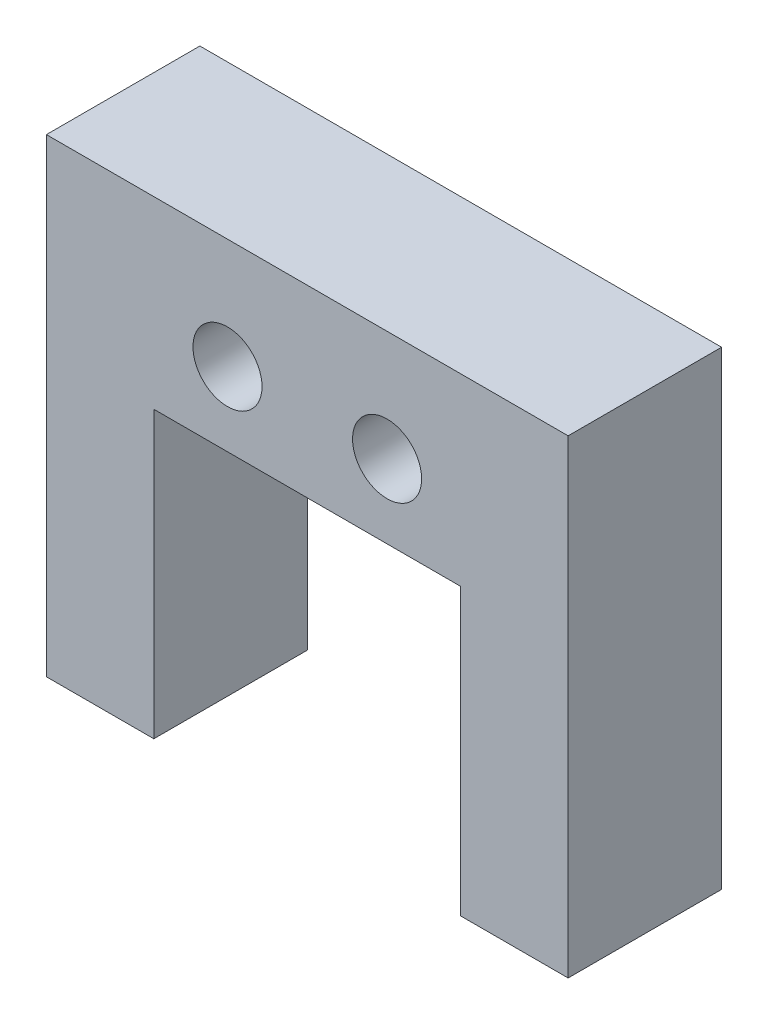
ISO-10303-21;
HEADER;
FILE_DESCRIPTION(('STEP AP214'),'2;1');
FILE_NAME('part.step','',(''),(''),'','','');
FILE_SCHEMA(('AUTOMOTIVE_DESIGN { 1 0 10303 214 1 1 1 1 }'));
ENDSEC;
DATA;
#1=APPLICATION_CONTEXT('core data for automotive mechanical design processes');
#2=APPLICATION_PROTOCOL_DEFINITION('international standard','automotive_design',2000,#1);
#3=PRODUCT_CONTEXT('',#1,'mechanical');
#4=PRODUCT('Part','Part','',(#3));
#5=PRODUCT_RELATED_PRODUCT_CATEGORY('part','',(#4));
#6=PRODUCT_DEFINITION_FORMATION('','',#4);
#7=PRODUCT_DEFINITION_CONTEXT('part definition',#1,'design');
#8=PRODUCT_DEFINITION('design','',#6,#7);
#9=PRODUCT_DEFINITION_SHAPE('','',#8);
#10=(LENGTH_UNIT() NAMED_UNIT(*) SI_UNIT(.MILLI.,.METRE.));
#11=(NAMED_UNIT(*) PLANE_ANGLE_UNIT() SI_UNIT($,.RADIAN.));
#12=(NAMED_UNIT(*) SI_UNIT($,.STERADIAN.) SOLID_ANGLE_UNIT());
#13=UNCERTAINTY_MEASURE_WITH_UNIT(LENGTH_MEASURE(1.E-05),#10,'distance_accuracy_value','');
#14=(GEOMETRIC_REPRESENTATION_CONTEXT(3) GLOBAL_UNCERTAINTY_ASSIGNED_CONTEXT((#13)) GLOBAL_UNIT_ASSIGNED_CONTEXT((#10,
#11,#12)) REPRESENTATION_CONTEXT('',''));
#15=CARTESIAN_POINT('',(0.,0.,0.));
#16=DIRECTION('',(0.,0.,1.));
#17=DIRECTION('',(1.,0.,0.));
#18=AXIS2_PLACEMENT_3D('',#15,#16,#17);
#19=CARTESIAN_POINT('',(0.,30.6,10.));
#20=DIRECTION('',(0.,0.,-1.));
#21=DIRECTION('',(-1.,0.,0.));
#22=AXIS2_PLACEMENT_3D('',#19,#20,#21);
#23=PLANE('',#22);
#24=CARTESIAN_POINT('',(22.2,23.4,10.));
#25=DIRECTION('',(0.,0.,1.));
#26=DIRECTION('',(1.,0.,0.));
#27=AXIS2_PLACEMENT_3D('',#24,#25,#26);
#28=CIRCLE('',#27,2.25);
#29=CARTESIAN_POINT('',(24.45,23.4,10.));
#30=VERTEX_POINT('',#29);
#31=EDGE_CURVE('E134',#30,#30,#28,.T.);
#32=ORIENTED_EDGE('',*,*,#31,.F.);
#33=EDGE_LOOP('',(#32));
#34=FACE_BOUND('',#33,.T.);
#35=DIRECTION('',(0.,-1.,0.));
#36=VECTOR('',#35,1.);
#37=CARTESIAN_POINT('',(0.,0.,10.));
#38=LINE('',#37,#36);
#39=CARTESIAN_POINT('',(0.,30.6,10.));
#40=VERTEX_POINT('',#39);
#41=CARTESIAN_POINT('',(0.,0.,10.));
#42=VERTEX_POINT('',#41);
#43=EDGE_CURVE('E145',#40,#42,#38,.T.);
#44=ORIENTED_EDGE('',*,*,#43,.T.);
#45=DIRECTION('',(1.,0.,0.));
#46=VECTOR('',#45,1.);
#47=CARTESIAN_POINT('',(0.,0.,10.));
#48=LINE('',#47,#46);
#49=CARTESIAN_POINT('',(7.,0.,10.));
#50=VERTEX_POINT('',#49);
#51=EDGE_CURVE('E93',#42,#50,#48,.T.);
#52=ORIENTED_EDGE('',*,*,#51,.T.);
#53=DIRECTION('',(0.,1.,0.));
#54=VECTOR('',#53,1.);
#55=CARTESIAN_POINT('',(7.,0.,10.));
#56=LINE('',#55,#54);
#57=CARTESIAN_POINT('',(7.,18.6,10.));
#58=VERTEX_POINT('',#57);
#59=EDGE_CURVE('E160',#50,#58,#56,.T.);
#60=ORIENTED_EDGE('',*,*,#59,.T.);
#61=DIRECTION('',(1.,0.,0.));
#62=VECTOR('',#61,1.);
#63=CARTESIAN_POINT('',(7.,18.6,10.));
#64=LINE('',#63,#62);
#65=CARTESIAN_POINT('',(27.,18.6,10.));
#66=VERTEX_POINT('',#65);
#67=EDGE_CURVE('E173',#58,#66,#64,.T.);
#68=ORIENTED_EDGE('',*,*,#67,.T.);
#69=DIRECTION('',(0.,-1.,0.));
#70=VECTOR('',#69,1.);
#71=CARTESIAN_POINT('',(27.,0.,10.));
#72=LINE('',#71,#70);
#73=CARTESIAN_POINT('',(27.,0.,10.));
#74=VERTEX_POINT('',#73);
#75=EDGE_CURVE('E112',#66,#74,#72,.T.);
#76=ORIENTED_EDGE('',*,*,#75,.T.);
#77=DIRECTION('',(1.,0.,0.));
#78=VECTOR('',#77,1.);
#79=CARTESIAN_POINT('',(27.,0.,10.));
#80=LINE('',#79,#78);
#81=CARTESIAN_POINT('',(34.,0.,10.));
#82=VERTEX_POINT('',#81);
#83=EDGE_CURVE('E106',#74,#82,#80,.T.);
#84=ORIENTED_EDGE('',*,*,#83,.T.);
#85=DIRECTION('',(0.,1.,0.));
#86=VECTOR('',#85,1.);
#87=CARTESIAN_POINT('',(34.,0.,10.));
#88=LINE('',#87,#86);
#89=CARTESIAN_POINT('',(34.,30.6,10.));
#90=VERTEX_POINT('',#89);
#91=EDGE_CURVE('E110',#82,#90,#88,.T.);
#92=ORIENTED_EDGE('',*,*,#91,.T.);
#93=DIRECTION('',(-1.,0.,0.));
#94=VECTOR('',#93,1.);
#95=CARTESIAN_POINT('',(0.,30.6,10.));
#96=LINE('',#95,#94);
#97=EDGE_CURVE('E50',#90,#40,#96,.T.);
#98=ORIENTED_EDGE('',*,*,#97,.T.);
#99=EDGE_LOOP('',(#44,#52,#60,#68,#76,#84,#92,#98));
#100=FACE_BOUND('',#99,.T.);
#101=CARTESIAN_POINT('',(11.8,23.4,10.));
#102=DIRECTION('',(0.,0.,1.));
#103=DIRECTION('',(1.,0.,0.));
#104=AXIS2_PLACEMENT_3D('',#101,#102,#103);
#105=CIRCLE('',#104,2.25000000000001);
#106=CARTESIAN_POINT('',(14.05,23.4,10.));
#107=VERTEX_POINT('',#106);
#108=EDGE_CURVE('E182',#107,#107,#105,.T.);
#109=ORIENTED_EDGE('',*,*,#108,.F.);
#110=EDGE_LOOP('',(#109));
#111=FACE_BOUND('',#110,.T.);
#112=ADVANCED_FACE('F33',(#34,#100,#111),#23,.F.);
#113=CARTESIAN_POINT('',(0.,30.6,0.));
#114=DIRECTION('',(0.,0.,-1.));
#115=DIRECTION('',(-1.,0.,0.));
#116=AXIS2_PLACEMENT_3D('',#113,#114,#115);
#117=PLANE('',#116);
#118=CARTESIAN_POINT('',(22.2,23.4,0.));
#119=DIRECTION('',(0.,0.,1.));
#120=DIRECTION('',(1.,0.,0.));
#121=AXIS2_PLACEMENT_3D('',#118,#119,#120);
#122=CIRCLE('',#121,2.25);
#123=CARTESIAN_POINT('',(24.45,23.4,0.));
#124=VERTEX_POINT('',#123);
#125=EDGE_CURVE('E179',#124,#124,#122,.T.);
#126=ORIENTED_EDGE('',*,*,#125,.T.);
#127=EDGE_LOOP('',(#126));
#128=FACE_BOUND('',#127,.T.);
#129=DIRECTION('',(0.,-1.,0.));
#130=VECTOR('',#129,1.);
#131=CARTESIAN_POINT('',(0.,0.,0.));
#132=LINE('',#131,#130);
#133=CARTESIAN_POINT('',(0.,30.6,0.));
#134=VERTEX_POINT('',#133);
#135=CARTESIAN_POINT('',(0.,0.,0.));
#136=VERTEX_POINT('',#135);
#137=EDGE_CURVE('E130',#134,#136,#132,.T.);
#138=ORIENTED_EDGE('',*,*,#137,.F.);
#139=DIRECTION('',(-1.,0.,0.));
#140=VECTOR('',#139,1.);
#141=CARTESIAN_POINT('',(0.,30.6,0.));
#142=LINE('',#141,#140);
#143=CARTESIAN_POINT('',(34.,30.6,0.));
#144=VERTEX_POINT('',#143);
#145=EDGE_CURVE('E85',#144,#134,#142,.T.);
#146=ORIENTED_EDGE('',*,*,#145,.F.);
#147=DIRECTION('',(0.,1.,0.));
#148=VECTOR('',#147,1.);
#149=CARTESIAN_POINT('',(34.,0.,0.));
#150=LINE('',#149,#148);
#151=CARTESIAN_POINT('',(34.,0.,0.));
#152=VERTEX_POINT('',#151);
#153=EDGE_CURVE('E79',#152,#144,#150,.T.);
#154=ORIENTED_EDGE('',*,*,#153,.F.);
#155=DIRECTION('',(1.,0.,0.));
#156=VECTOR('',#155,1.);
#157=CARTESIAN_POINT('',(27.,0.,0.));
#158=LINE('',#157,#156);
#159=CARTESIAN_POINT('',(27.,0.,0.));
#160=VERTEX_POINT('',#159);
#161=EDGE_CURVE('E120',#160,#152,#158,.T.);
#162=ORIENTED_EDGE('',*,*,#161,.F.);
#163=DIRECTION('',(0.,-1.,0.));
#164=VECTOR('',#163,1.);
#165=CARTESIAN_POINT('',(27.,0.,0.));
#166=LINE('',#165,#164);
#167=CARTESIAN_POINT('',(27.,18.6,0.));
#168=VERTEX_POINT('',#167);
#169=EDGE_CURVE('E140',#168,#160,#166,.T.);
#170=ORIENTED_EDGE('',*,*,#169,.F.);
#171=DIRECTION('',(1.,0.,0.));
#172=VECTOR('',#171,1.);
#173=CARTESIAN_POINT('',(7.,18.6,0.));
#174=LINE('',#173,#172);
#175=CARTESIAN_POINT('',(7.,18.6,0.));
#176=VERTEX_POINT('',#175);
#177=EDGE_CURVE('E138',#176,#168,#174,.T.);
#178=ORIENTED_EDGE('',*,*,#177,.F.);
#179=DIRECTION('',(0.,1.,0.));
#180=VECTOR('',#179,1.);
#181=CARTESIAN_POINT('',(7.,0.,0.));
#182=LINE('',#181,#180);
#183=CARTESIAN_POINT('',(7.,0.,0.));
#184=VERTEX_POINT('',#183);
#185=EDGE_CURVE('E136',#184,#176,#182,.T.);
#186=ORIENTED_EDGE('',*,*,#185,.F.);
#187=DIRECTION('',(1.,0.,0.));
#188=VECTOR('',#187,1.);
#189=CARTESIAN_POINT('',(0.,0.,0.));
#190=LINE('',#189,#188);
#191=EDGE_CURVE('E133',#136,#184,#190,.T.);
#192=ORIENTED_EDGE('',*,*,#191,.F.);
#193=EDGE_LOOP('',(#138,#146,#154,#162,#170,#178,#186,#192));
#194=FACE_BOUND('',#193,.T.);
#195=CARTESIAN_POINT('',(11.8,23.4,0.));
#196=DIRECTION('',(0.,0.,1.));
#197=DIRECTION('',(1.,0.,0.));
#198=AXIS2_PLACEMENT_3D('',#195,#196,#197);
#199=CIRCLE('',#198,2.25000000000001);
#200=CARTESIAN_POINT('',(14.05,23.4,0.));
#201=VERTEX_POINT('',#200);
#202=EDGE_CURVE('E185',#201,#201,#199,.T.);
#203=ORIENTED_EDGE('',*,*,#202,.T.);
#204=EDGE_LOOP('',(#203));
#205=FACE_BOUND('',#204,.T.);
#206=ADVANCED_FACE('F164',(#128,#194,#205),#117,.T.);
#207=CARTESIAN_POINT('',(0.,0.,10.));
#208=DIRECTION('',(1.,0.,0.));
#209=DIRECTION('',(0.,0.,-1.));
#210=AXIS2_PLACEMENT_3D('',#207,#208,#209);
#211=PLANE('',#210);
#212=ORIENTED_EDGE('',*,*,#137,.T.);
#213=DIRECTION('',(0.,0.,-1.));
#214=VECTOR('',#213,1.);
#215=CARTESIAN_POINT('',(0.,0.,10.));
#216=LINE('',#215,#214);
#217=EDGE_CURVE('E11',#42,#136,#216,.T.);
#218=ORIENTED_EDGE('',*,*,#217,.F.);
#219=ORIENTED_EDGE('',*,*,#43,.F.);
#220=DIRECTION('',(0.,0.,-1.));
#221=VECTOR('',#220,1.);
#222=CARTESIAN_POINT('',(0.,30.6,10.));
#223=LINE('',#222,#221);
#224=EDGE_CURVE('E126',#40,#134,#223,.T.);
#225=ORIENTED_EDGE('',*,*,#224,.T.);
#226=EDGE_LOOP('',(#212,#218,#219,#225));
#227=FACE_BOUND('',#226,.T.);
#228=ADVANCED_FACE('F35',(#227),#211,.F.);
#229=CARTESIAN_POINT('',(0.,0.,10.));
#230=DIRECTION('',(0.,1.,0.));
#231=DIRECTION('',(0.,0.,1.));
#232=AXIS2_PLACEMENT_3D('',#229,#230,#231);
#233=PLANE('',#232);
#234=ORIENTED_EDGE('',*,*,#191,.T.);
#235=DIRECTION('',(0.,0.,-1.));
#236=VECTOR('',#235,1.);
#237=CARTESIAN_POINT('',(7.,0.,10.));
#238=LINE('',#237,#236);
#239=EDGE_CURVE('E42',#50,#184,#238,.T.);
#240=ORIENTED_EDGE('',*,*,#239,.F.);
#241=ORIENTED_EDGE('',*,*,#51,.F.);
#242=ORIENTED_EDGE('',*,*,#217,.T.);
#243=EDGE_LOOP('',(#234,#240,#241,#242));
#244=FACE_BOUND('',#243,.T.);
#245=ADVANCED_FACE('F218',(#244),#233,.F.);
#246=CARTESIAN_POINT('',(7.,0.,10.));
#247=DIRECTION('',(-1.,0.,0.));
#248=DIRECTION('',(0.,0.,1.));
#249=AXIS2_PLACEMENT_3D('',#246,#247,#248);
#250=PLANE('',#249);
#251=ORIENTED_EDGE('',*,*,#185,.T.);
#252=DIRECTION('',(0.,0.,-1.));
#253=VECTOR('',#252,1.);
#254=CARTESIAN_POINT('',(7.,18.6,10.));
#255=LINE('',#254,#253);
#256=EDGE_CURVE('E152',#58,#176,#255,.T.);
#257=ORIENTED_EDGE('',*,*,#256,.F.);
#258=ORIENTED_EDGE('',*,*,#59,.F.);
#259=ORIENTED_EDGE('',*,*,#239,.T.);
#260=EDGE_LOOP('',(#251,#257,#258,#259));
#261=FACE_BOUND('',#260,.T.);
#262=ADVANCED_FACE('F158',(#261),#250,.F.);
#263=CARTESIAN_POINT('',(7.,18.6,10.));
#264=DIRECTION('',(0.,1.,0.));
#265=DIRECTION('',(0.,0.,1.));
#266=AXIS2_PLACEMENT_3D('',#263,#264,#265);
#267=PLANE('',#266);
#268=ORIENTED_EDGE('',*,*,#177,.T.);
#269=DIRECTION('',(0.,0.,-1.));
#270=VECTOR('',#269,1.);
#271=CARTESIAN_POINT('',(27.,18.6,10.));
#272=LINE('',#271,#270);
#273=EDGE_CURVE('E149',#66,#168,#272,.T.);
#274=ORIENTED_EDGE('',*,*,#273,.F.);
#275=ORIENTED_EDGE('',*,*,#67,.F.);
#276=ORIENTED_EDGE('',*,*,#256,.T.);
#277=EDGE_LOOP('',(#268,#274,#275,#276));
#278=FACE_BOUND('',#277,.T.);
#279=ADVANCED_FACE('F169',(#278),#267,.F.);
#280=CARTESIAN_POINT('',(27.,0.,10.));
#281=DIRECTION('',(1.,0.,0.));
#282=DIRECTION('',(0.,0.,-1.));
#283=AXIS2_PLACEMENT_3D('',#280,#281,#282);
#284=PLANE('',#283);
#285=ORIENTED_EDGE('',*,*,#169,.T.);
#286=DIRECTION('',(0.,0.,-1.));
#287=VECTOR('',#286,1.);
#288=CARTESIAN_POINT('',(27.,0.,10.));
#289=LINE('',#288,#287);
#290=EDGE_CURVE('E121',#74,#160,#289,.T.);
#291=ORIENTED_EDGE('',*,*,#290,.F.);
#292=ORIENTED_EDGE('',*,*,#75,.F.);
#293=ORIENTED_EDGE('',*,*,#273,.T.);
#294=EDGE_LOOP('',(#285,#291,#292,#293));
#295=FACE_BOUND('',#294,.T.);
#296=ADVANCED_FACE('F172',(#295),#284,.F.);
#297=CARTESIAN_POINT('',(27.,0.,10.));
#298=DIRECTION('',(0.,1.,0.));
#299=DIRECTION('',(0.,0.,1.));
#300=AXIS2_PLACEMENT_3D('',#297,#298,#299);
#301=PLANE('',#300);
#302=ORIENTED_EDGE('',*,*,#161,.T.);
#303=DIRECTION('',(0.,0.,-1.));
#304=VECTOR('',#303,1.);
#305=CARTESIAN_POINT('',(34.,0.,10.));
#306=LINE('',#305,#304);
#307=EDGE_CURVE('E117',#82,#152,#306,.T.);
#308=ORIENTED_EDGE('',*,*,#307,.F.);
#309=ORIENTED_EDGE('',*,*,#83,.F.);
#310=ORIENTED_EDGE('',*,*,#290,.T.);
#311=EDGE_LOOP('',(#302,#308,#309,#310));
#312=FACE_BOUND('',#311,.T.);
#313=ADVANCED_FACE('F118',(#312),#301,.F.);
#314=CARTESIAN_POINT('',(34.,0.,10.));
#315=DIRECTION('',(-1.,0.,0.));
#316=DIRECTION('',(0.,0.,1.));
#317=AXIS2_PLACEMENT_3D('',#314,#315,#316);
#318=PLANE('',#317);
#319=ORIENTED_EDGE('',*,*,#153,.T.);
#320=DIRECTION('',(0.,0.,-1.));
#321=VECTOR('',#320,1.);
#322=CARTESIAN_POINT('',(34.,30.6,10.));
#323=LINE('',#322,#321);
#324=EDGE_CURVE('E122',#90,#144,#323,.T.);
#325=ORIENTED_EDGE('',*,*,#324,.F.);
#326=ORIENTED_EDGE('',*,*,#91,.F.);
#327=ORIENTED_EDGE('',*,*,#307,.T.);
#328=EDGE_LOOP('',(#319,#325,#326,#327));
#329=FACE_BOUND('',#328,.T.);
#330=ADVANCED_FACE('F124',(#329),#318,.F.);
#331=CARTESIAN_POINT('',(0.,30.6,10.));
#332=DIRECTION('',(0.,-1.,0.));
#333=DIRECTION('',(0.,0.,-1.));
#334=AXIS2_PLACEMENT_3D('',#331,#332,#333);
#335=PLANE('',#334);
#336=ORIENTED_EDGE('',*,*,#145,.T.);
#337=ORIENTED_EDGE('',*,*,#224,.F.);
#338=ORIENTED_EDGE('',*,*,#97,.F.);
#339=ORIENTED_EDGE('',*,*,#324,.T.);
#340=EDGE_LOOP('',(#336,#337,#338,#339));
#341=FACE_BOUND('',#340,.T.);
#342=ADVANCED_FACE('F206',(#341),#335,.F.);
#343=CARTESIAN_POINT('',(22.2,23.4,10.));
#344=DIRECTION('',(0.,0.,-1.));
#345=DIRECTION('',(-1.,0.,0.));
#346=AXIS2_PLACEMENT_3D('',#343,#344,#345);
#347=CYLINDRICAL_SURFACE('',#346,2.25);
#348=ORIENTED_EDGE('',*,*,#31,.T.);
#349=EDGE_LOOP('',(#348));
#350=FACE_BOUND('',#349,.T.);
#351=ORIENTED_EDGE('',*,*,#125,.F.);
#352=EDGE_LOOP('',(#351));
#353=FACE_BOUND('',#352,.T.);
#354=ADVANCED_FACE('F203',(#350,#353),#347,.F.);
#355=CARTESIAN_POINT('',(11.8,23.4,10.));
#356=DIRECTION('',(0.,0.,-1.));
#357=DIRECTION('',(-1.,0.,0.));
#358=AXIS2_PLACEMENT_3D('',#355,#356,#357);
#359=CYLINDRICAL_SURFACE('',#358,2.25000000000001);
#360=ORIENTED_EDGE('',*,*,#108,.T.);
#361=EDGE_LOOP('',(#360));
#362=FACE_BOUND('',#361,.T.);
#363=ORIENTED_EDGE('',*,*,#202,.F.);
#364=EDGE_LOOP('',(#363));
#365=FACE_BOUND('',#364,.T.);
#366=ADVANCED_FACE('F191',(#362,#365),#359,.F.);
#367=CLOSED_SHELL('',(#112,#206,#228,#245,#262,#279,#296,#313,#330,#342,#354,#366));
#368=MANIFOLD_SOLID_BREP('B2',#367);
#369=ADVANCED_BREP_SHAPE_REPRESENTATION('',(#18,#368),#14);
#370=SHAPE_DEFINITION_REPRESENTATION(#9,#369);
ENDSEC;
END-ISO-10303-21;
